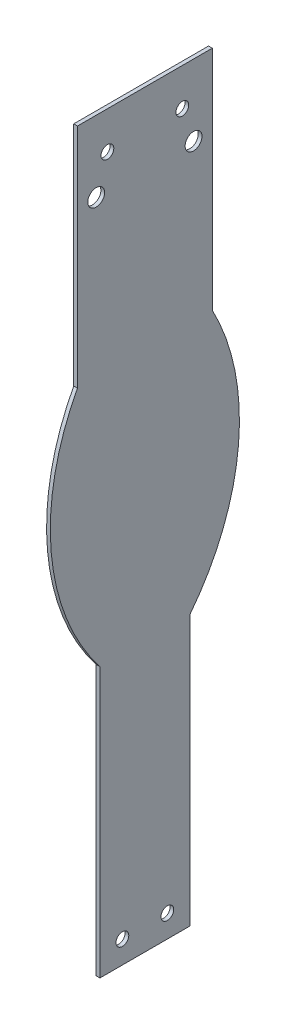
ISO-10303-21;
HEADER;
FILE_DESCRIPTION(('STEP AP214'),'2;1');
FILE_NAME('part.step','',(''),(''),'','','');
FILE_SCHEMA(('AUTOMOTIVE_DESIGN { 1 0 10303 214 1 1 1 1 }'));
ENDSEC;
DATA;
#1=APPLICATION_CONTEXT('core data for automotive mechanical design processes');
#2=APPLICATION_PROTOCOL_DEFINITION('international standard','automotive_design',2000,#1);
#3=PRODUCT_CONTEXT('',#1,'mechanical');
#4=PRODUCT('Part','Part','',(#3));
#5=PRODUCT_RELATED_PRODUCT_CATEGORY('part','',(#4));
#6=PRODUCT_DEFINITION_FORMATION('','',#4);
#7=PRODUCT_DEFINITION_CONTEXT('part definition',#1,'design');
#8=PRODUCT_DEFINITION('design','',#6,#7);
#9=PRODUCT_DEFINITION_SHAPE('','',#8);
#10=(LENGTH_UNIT() NAMED_UNIT(*) SI_UNIT(.MILLI.,.METRE.));
#11=(NAMED_UNIT(*) PLANE_ANGLE_UNIT() SI_UNIT($,.RADIAN.));
#12=(NAMED_UNIT(*) SI_UNIT($,.STERADIAN.) SOLID_ANGLE_UNIT());
#13=UNCERTAINTY_MEASURE_WITH_UNIT(LENGTH_MEASURE(1.E-05),#10,'distance_accuracy_value','');
#14=(GEOMETRIC_REPRESENTATION_CONTEXT(3) GLOBAL_UNCERTAINTY_ASSIGNED_CONTEXT((#13)) GLOBAL_UNIT_ASSIGNED_CONTEXT((#10,
#11,#12)) REPRESENTATION_CONTEXT('',''));
#15=CARTESIAN_POINT('',(0.,0.,0.));
#16=DIRECTION('',(0.,0.,1.));
#17=DIRECTION('',(1.,0.,0.));
#18=AXIS2_PLACEMENT_3D('',#15,#16,#17);
#19=CARTESIAN_POINT('',(1.,0.,18.));
#20=DIRECTION('',(0.,0.,-1.));
#21=DIRECTION('',(-1.,0.,0.));
#22=AXIS2_PLACEMENT_3D('',#19,#20,#21);
#23=PLANE('',#22);
#24=DIRECTION('',(0.,-1.,0.));
#25=VECTOR('',#24,1.);
#26=CARTESIAN_POINT('',(0.,0.,18.));
#27=LINE('',#26,#25);
#28=CARTESIAN_POINT('',(0.,0.,18.));
#29=VERTEX_POINT('',#28);
#30=CARTESIAN_POINT('',(0.,-60.6171169772277,18.));
#31=VERTEX_POINT('',#30);
#32=EDGE_CURVE('E132',#29,#31,#27,.T.);
#33=ORIENTED_EDGE('',*,*,#32,.T.);
#34=DIRECTION('',(-1.,0.,0.));
#35=VECTOR('',#34,1.);
#36=CARTESIAN_POINT('',(1.,-60.6171169772277,18.));
#37=LINE('',#36,#35);
#38=CARTESIAN_POINT('',(1.,-60.6171169772277,18.));
#39=VERTEX_POINT('',#38);
#40=EDGE_CURVE('E11',#39,#31,#37,.T.);
#41=ORIENTED_EDGE('',*,*,#40,.F.);
#42=DIRECTION('',(0.,-1.,0.));
#43=VECTOR('',#42,1.);
#44=CARTESIAN_POINT('',(1.,0.,18.));
#45=LINE('',#44,#43);
#46=CARTESIAN_POINT('',(1.,0.,18.));
#47=VERTEX_POINT('',#46);
#48=EDGE_CURVE('E153',#47,#39,#45,.T.);
#49=ORIENTED_EDGE('',*,*,#48,.F.);
#50=DIRECTION('',(-1.,0.,0.));
#51=VECTOR('',#50,1.);
#52=CARTESIAN_POINT('',(1.,0.,18.));
#53=LINE('',#52,#51);
#54=EDGE_CURVE('E51',#47,#29,#53,.T.);
#55=ORIENTED_EDGE('',*,*,#54,.T.);
#56=EDGE_LOOP('',(#33,#41,#49,#55));
#57=FACE_BOUND('',#56,.T.);
#58=ADVANCED_FACE('F35',(#57),#23,.F.);
#59=CARTESIAN_POINT('',(1.,-89.7000591872468,-36.7556615557578));
#60=DIRECTION('',(-1.,0.,0.));
#61=DIRECTION('',(0.,0.,1.));
#62=AXIS2_PLACEMENT_3D('',#59,#60,#61);
#63=CYLINDRICAL_SURFACE('',#62,62.);
#64=CARTESIAN_POINT('',(0.,-89.7000591872468,-36.7556615557578));
#65=DIRECTION('',(1.,0.,0.));
#66=DIRECTION('',(0.,0.,-1.));
#67=AXIS2_PLACEMENT_3D('',#64,#65,#66);
#68=CIRCLE('',#67,62.);
#69=CARTESIAN_POINT('',(0.,-128.,12.));
#70=VERTEX_POINT('',#69);
#71=EDGE_CURVE('E134',#31,#70,#68,.T.);
#72=ORIENTED_EDGE('',*,*,#71,.T.);
#73=DIRECTION('',(-1.,0.,0.));
#74=VECTOR('',#73,1.);
#75=CARTESIAN_POINT('',(1.,-128.,12.));
#76=LINE('',#75,#74);
#77=CARTESIAN_POINT('',(1.,-128.,12.));
#78=VERTEX_POINT('',#77);
#79=EDGE_CURVE('E43',#78,#70,#76,.T.);
#80=ORIENTED_EDGE('',*,*,#79,.F.);
#81=CARTESIAN_POINT('',(1.,-89.7000591872468,-36.7556615557578));
#82=DIRECTION('',(1.,0.,0.));
#83=DIRECTION('',(0.,0.,-1.));
#84=AXIS2_PLACEMENT_3D('',#81,#82,#83);
#85=CIRCLE('',#84,62.);
#86=EDGE_CURVE('E89',#39,#78,#85,.T.);
#87=ORIENTED_EDGE('',*,*,#86,.F.);
#88=ORIENTED_EDGE('',*,*,#40,.T.);
#89=EDGE_LOOP('',(#72,#80,#87,#88));
#90=FACE_BOUND('',#89,.T.);
#91=ADVANCED_FACE('F166',(#90),#63,.T.);
#92=CARTESIAN_POINT('',(1.,-200.,12.));
#93=DIRECTION('',(0.,0.,1.));
#94=DIRECTION('',(1.,0.,0.));
#95=AXIS2_PLACEMENT_3D('',#92,#93,#94);
#96=PLANE('',#95);
#97=DIRECTION('',(0.,1.,0.));
#98=VECTOR('',#97,1.);
#99=CARTESIAN_POINT('',(0.,-200.,12.));
#100=LINE('',#99,#98);
#101=CARTESIAN_POINT('',(0.,-200.,12.));
#102=VERTEX_POINT('',#101);
#103=EDGE_CURVE('E138',#102,#70,#100,.T.);
#104=ORIENTED_EDGE('',*,*,#103,.F.);
#105=DIRECTION('',(-1.,0.,0.));
#106=VECTOR('',#105,1.);
#107=CARTESIAN_POINT('',(1.,-200.,12.));
#108=LINE('',#107,#106);
#109=CARTESIAN_POINT('',(1.,-200.,12.));
#110=VERTEX_POINT('',#109);
#111=EDGE_CURVE('E159',#110,#102,#108,.T.);
#112=ORIENTED_EDGE('',*,*,#111,.F.);
#113=DIRECTION('',(0.,1.,0.));
#114=VECTOR('',#113,1.);
#115=CARTESIAN_POINT('',(1.,-200.,12.));
#116=LINE('',#115,#114);
#117=EDGE_CURVE('E165',#110,#78,#116,.T.);
#118=ORIENTED_EDGE('',*,*,#117,.T.);
#119=ORIENTED_EDGE('',*,*,#79,.T.);
#120=EDGE_LOOP('',(#104,#112,#118,#119));
#121=FACE_BOUND('',#120,.T.);
#122=ADVANCED_FACE('F163',(#121),#96,.T.);
#123=CARTESIAN_POINT('',(1.,-200.,-12.0000000000001));
#124=DIRECTION('',(0.,-1.,0.));
#125=DIRECTION('',(0.,0.,-1.));
#126=AXIS2_PLACEMENT_3D('',#123,#124,#125);
#127=PLANE('',#126);
#128=DIRECTION('',(0.,0.,1.));
#129=VECTOR('',#128,1.);
#130=CARTESIAN_POINT('',(0.,-200.,-12.0000000000001));
#131=LINE('',#130,#129);
#132=CARTESIAN_POINT('',(0.,-200.,-12.0000000000001));
#133=VERTEX_POINT('',#132);
#134=EDGE_CURVE('E141',#133,#102,#131,.T.);
#135=ORIENTED_EDGE('',*,*,#134,.F.);
#136=DIRECTION('',(-1.,0.,0.));
#137=VECTOR('',#136,1.);
#138=CARTESIAN_POINT('',(1.,-200.,-12.0000000000001));
#139=LINE('',#138,#137);
#140=CARTESIAN_POINT('',(1.,-200.,-12.0000000000001));
#141=VERTEX_POINT('',#140);
#142=EDGE_CURVE('E157',#141,#133,#139,.T.);
#143=ORIENTED_EDGE('',*,*,#142,.F.);
#144=DIRECTION('',(0.,0.,1.));
#145=VECTOR('',#144,1.);
#146=CARTESIAN_POINT('',(1.,-200.,-12.0000000000001));
#147=LINE('',#146,#145);
#148=EDGE_CURVE('E175',#141,#110,#147,.T.);
#149=ORIENTED_EDGE('',*,*,#148,.T.);
#150=ORIENTED_EDGE('',*,*,#111,.T.);
#151=EDGE_LOOP('',(#135,#143,#149,#150));
#152=FACE_BOUND('',#151,.T.);
#153=ADVANCED_FACE('F173',(#152),#127,.T.);
#154=CARTESIAN_POINT('',(1.,-200.,-12.0000000000001));
#155=DIRECTION('',(0.,0.,1.));
#156=DIRECTION('',(0.,-1.,0.));
#157=AXIS2_PLACEMENT_3D('',#154,#155,#156);
#158=PLANE('',#157);
#159=DIRECTION('',(0.,1.,0.));
#160=VECTOR('',#159,1.);
#161=CARTESIAN_POINT('',(0.,-200.,-12.0000000000001));
#162=LINE('',#161,#160);
#163=CARTESIAN_POINT('',(0.,-128.,-12.0000000000001));
#164=VERTEX_POINT('',#163);
#165=EDGE_CURVE('E144',#133,#164,#162,.T.);
#166=ORIENTED_EDGE('',*,*,#165,.T.);
#167=DIRECTION('',(-1.,0.,0.));
#168=VECTOR('',#167,1.);
#169=CARTESIAN_POINT('',(1.,-128.,-12.0000000000001));
#170=LINE('',#169,#168);
#171=CARTESIAN_POINT('',(1.,-128.,-12.0000000000001));
#172=VERTEX_POINT('',#171);
#173=EDGE_CURVE('E114',#172,#164,#170,.T.);
#174=ORIENTED_EDGE('',*,*,#173,.F.);
#175=DIRECTION('',(0.,1.,0.));
#176=VECTOR('',#175,1.);
#177=CARTESIAN_POINT('',(1.,-200.,-12.0000000000001));
#178=LINE('',#177,#176);
#179=EDGE_CURVE('E123',#141,#172,#178,.T.);
#180=ORIENTED_EDGE('',*,*,#179,.F.);
#181=ORIENTED_EDGE('',*,*,#142,.T.);
#182=EDGE_LOOP('',(#166,#174,#180,#181));
#183=FACE_BOUND('',#182,.T.);
#184=ADVANCED_FACE('F261',(#183),#158,.F.);
#185=CARTESIAN_POINT('',(1.,-89.7000591872468,36.7556615557577));
#186=DIRECTION('',(-1.,0.,0.));
#187=DIRECTION('',(0.,0.,1.));
#188=AXIS2_PLACEMENT_3D('',#185,#186,#187);
#189=CYLINDRICAL_SURFACE('',#188,62.);
#190=CARTESIAN_POINT('',(0.,-89.7000591872468,36.7556615557577));
#191=DIRECTION('',(-1.,0.,0.));
#192=DIRECTION('',(0.,0.,1.));
#193=AXIS2_PLACEMENT_3D('',#190,#191,#192);
#194=CIRCLE('',#193,62.);
#195=CARTESIAN_POINT('',(0.,-60.6171169772277,-18.));
#196=VERTEX_POINT('',#195);
#197=EDGE_CURVE('E110',#196,#164,#194,.T.);
#198=ORIENTED_EDGE('',*,*,#197,.F.);
#199=DIRECTION('',(-1.,0.,0.));
#200=VECTOR('',#199,1.);
#201=CARTESIAN_POINT('',(1.,-60.6171169772277,-18.));
#202=LINE('',#201,#200);
#203=CARTESIAN_POINT('',(1.,-60.6171169772277,-18.));
#204=VERTEX_POINT('',#203);
#205=EDGE_CURVE('E105',#204,#196,#202,.T.);
#206=ORIENTED_EDGE('',*,*,#205,.F.);
#207=CARTESIAN_POINT('',(1.,-89.7000591872468,36.7556615557577));
#208=DIRECTION('',(-1.,0.,0.));
#209=DIRECTION('',(0.,0.,1.));
#210=AXIS2_PLACEMENT_3D('',#207,#208,#209);
#211=CIRCLE('',#210,62.);
#212=EDGE_CURVE('E108',#204,#172,#211,.T.);
#213=ORIENTED_EDGE('',*,*,#212,.T.);
#214=ORIENTED_EDGE('',*,*,#173,.T.);
#215=EDGE_LOOP('',(#198,#206,#213,#214));
#216=FACE_BOUND('',#215,.T.);
#217=ADVANCED_FACE('F107',(#216),#189,.T.);
#218=CARTESIAN_POINT('',(1.,0.,-18.));
#219=DIRECTION('',(0.,0.,-1.));
#220=DIRECTION('',(0.,1.,0.));
#221=AXIS2_PLACEMENT_3D('',#218,#219,#220);
#222=PLANE('',#221);
#223=DIRECTION('',(0.,-1.,0.));
#224=VECTOR('',#223,1.);
#225=CARTESIAN_POINT('',(0.,0.,-18.));
#226=LINE('',#225,#224);
#227=CARTESIAN_POINT('',(0.,0.,-18.));
#228=VERTEX_POINT('',#227);
#229=EDGE_CURVE('E148',#228,#196,#226,.T.);
#230=ORIENTED_EDGE('',*,*,#229,.F.);
#231=DIRECTION('',(-1.,0.,0.));
#232=VECTOR('',#231,1.);
#233=CARTESIAN_POINT('',(1.,0.,-18.));
#234=LINE('',#233,#232);
#235=CARTESIAN_POINT('',(1.,0.,-18.));
#236=VERTEX_POINT('',#235);
#237=EDGE_CURVE('E77',#236,#228,#234,.T.);
#238=ORIENTED_EDGE('',*,*,#237,.F.);
#239=DIRECTION('',(0.,-1.,0.));
#240=VECTOR('',#239,1.);
#241=CARTESIAN_POINT('',(1.,0.,-18.));
#242=LINE('',#241,#240);
#243=EDGE_CURVE('E120',#236,#204,#242,.T.);
#244=ORIENTED_EDGE('',*,*,#243,.T.);
#245=ORIENTED_EDGE('',*,*,#205,.T.);
#246=EDGE_LOOP('',(#230,#238,#244,#245));
#247=FACE_BOUND('',#246,.T.);
#248=ADVANCED_FACE('F126',(#247),#222,.T.);
#249=CARTESIAN_POINT('',(1.,0.,18.));
#250=DIRECTION('',(0.,1.,0.));
#251=DIRECTION('',(0.,0.,1.));
#252=AXIS2_PLACEMENT_3D('',#249,#250,#251);
#253=PLANE('',#252);
#254=DIRECTION('',(0.,0.,-1.));
#255=VECTOR('',#254,1.);
#256=CARTESIAN_POINT('',(0.,0.,18.));
#257=LINE('',#256,#255);
#258=EDGE_CURVE('E150',#29,#228,#257,.T.);
#259=ORIENTED_EDGE('',*,*,#258,.F.);
#260=ORIENTED_EDGE('',*,*,#54,.F.);
#261=DIRECTION('',(0.,0.,-1.));
#262=VECTOR('',#261,1.);
#263=CARTESIAN_POINT('',(1.,0.,18.));
#264=LINE('',#263,#262);
#265=EDGE_CURVE('E127',#47,#236,#264,.T.);
#266=ORIENTED_EDGE('',*,*,#265,.T.);
#267=ORIENTED_EDGE('',*,*,#237,.T.);
#268=EDGE_LOOP('',(#259,#260,#266,#267));
#269=FACE_BOUND('',#268,.T.);
#270=ADVANCED_FACE('F249',(#269),#253,.T.);
#271=CARTESIAN_POINT('',(1.,-89.7000591872468,-36.7556615557578));
#272=DIRECTION('',(1.,0.,0.));
#273=DIRECTION('',(0.,0.,-1.));
#274=AXIS2_PLACEMENT_3D('',#271,#272,#273);
#275=PLANE('',#274);
#276=CARTESIAN_POINT('',(1.,-194.,6.));
#277=DIRECTION('',(-1.,0.,0.));
#278=DIRECTION('',(0.,0.,1.));
#279=AXIS2_PLACEMENT_3D('',#276,#277,#278);
#280=CIRCLE('',#279,1.70000000000001);
#281=CARTESIAN_POINT('',(1.,-194.,7.70000000000001));
#282=VERTEX_POINT('',#281);
#283=EDGE_CURVE('E210',#282,#282,#280,.T.);
#284=ORIENTED_EDGE('',*,*,#283,.T.);
#285=EDGE_LOOP('',(#284));
#286=FACE_BOUND('',#285,.T.);
#287=CARTESIAN_POINT('',(1.,-194.,-6.));
#288=DIRECTION('',(-1.,0.,0.));
#289=DIRECTION('',(0.,0.,1.));
#290=AXIS2_PLACEMENT_3D('',#287,#288,#289);
#291=CIRCLE('',#290,1.70000000000001);
#292=CARTESIAN_POINT('',(1.,-194.,-4.29999999999999));
#293=VERTEX_POINT('',#292);
#294=EDGE_CURVE('E204',#293,#293,#291,.T.);
#295=ORIENTED_EDGE('',*,*,#294,.T.);
#296=EDGE_LOOP('',(#295));
#297=FACE_BOUND('',#296,.T.);
#298=CARTESIAN_POINT('',(1.,-10.,-10.));
#299=DIRECTION('',(-1.,0.,0.));
#300=DIRECTION('',(0.,0.,1.));
#301=AXIS2_PLACEMENT_3D('',#298,#299,#300);
#302=CIRCLE('',#301,1.7);
#303=CARTESIAN_POINT('',(1.,-10.,-8.3));
#304=VERTEX_POINT('',#303);
#305=EDGE_CURVE('E198',#304,#304,#302,.T.);
#306=ORIENTED_EDGE('',*,*,#305,.T.);
#307=EDGE_LOOP('',(#306));
#308=FACE_BOUND('',#307,.T.);
#309=CARTESIAN_POINT('',(1.,-10.,10.));
#310=DIRECTION('',(-1.,0.,0.));
#311=DIRECTION('',(0.,0.,1.));
#312=AXIS2_PLACEMENT_3D('',#309,#310,#311);
#313=CIRCLE('',#312,1.7);
#314=CARTESIAN_POINT('',(1.,-10.,11.7));
#315=VERTEX_POINT('',#314);
#316=EDGE_CURVE('E192',#315,#315,#313,.T.);
#317=ORIENTED_EDGE('',*,*,#316,.T.);
#318=EDGE_LOOP('',(#317));
#319=FACE_BOUND('',#318,.T.);
#320=CARTESIAN_POINT('',(1.,-19.,13.));
#321=DIRECTION('',(-1.,0.,0.));
#322=DIRECTION('',(0.,0.,1.));
#323=AXIS2_PLACEMENT_3D('',#320,#321,#322);
#324=CIRCLE('',#323,2.25);
#325=CARTESIAN_POINT('',(1.,-19.,15.25));
#326=VERTEX_POINT('',#325);
#327=EDGE_CURVE('E186',#326,#326,#324,.T.);
#328=ORIENTED_EDGE('',*,*,#327,.T.);
#329=EDGE_LOOP('',(#328));
#330=FACE_BOUND('',#329,.T.);
#331=CARTESIAN_POINT('',(1.,-19.,-13.));
#332=DIRECTION('',(-1.,0.,0.));
#333=DIRECTION('',(0.,0.,1.));
#334=AXIS2_PLACEMENT_3D('',#331,#332,#333);
#335=CIRCLE('',#334,2.25);
#336=CARTESIAN_POINT('',(1.,-19.,-10.75));
#337=VERTEX_POINT('',#336);
#338=EDGE_CURVE('E135',#337,#337,#335,.T.);
#339=ORIENTED_EDGE('',*,*,#338,.T.);
#340=EDGE_LOOP('',(#339));
#341=FACE_BOUND('',#340,.T.);
#342=ORIENTED_EDGE('',*,*,#48,.T.);
#343=ORIENTED_EDGE('',*,*,#86,.T.);
#344=ORIENTED_EDGE('',*,*,#117,.F.);
#345=ORIENTED_EDGE('',*,*,#148,.F.);
#346=ORIENTED_EDGE('',*,*,#179,.T.);
#347=ORIENTED_EDGE('',*,*,#212,.F.);
#348=ORIENTED_EDGE('',*,*,#243,.F.);
#349=ORIENTED_EDGE('',*,*,#265,.F.);
#350=EDGE_LOOP('',(#342,#343,#344,#345,#346,#347,#348,#349));
#351=FACE_BOUND('',#350,.T.);
#352=ADVANCED_FACE('F118',(#286,#297,#308,#319,#330,#341,#351),#275,.T.);
#353=CARTESIAN_POINT('',(0.,-89.7000591872468,-36.7556615557578));
#354=DIRECTION('',(1.,0.,0.));
#355=DIRECTION('',(0.,0.,-1.));
#356=AXIS2_PLACEMENT_3D('',#353,#354,#355);
#357=PLANE('',#356);
#358=CARTESIAN_POINT('',(0.,-194.,6.));
#359=DIRECTION('',(-1.,0.,0.));
#360=DIRECTION('',(0.,0.,1.));
#361=AXIS2_PLACEMENT_3D('',#358,#359,#360);
#362=CIRCLE('',#361,1.69999999999998);
#363=CARTESIAN_POINT('',(0.,-194.,7.69999999999998));
#364=VERTEX_POINT('',#363);
#365=EDGE_CURVE('E213',#364,#364,#362,.T.);
#366=ORIENTED_EDGE('',*,*,#365,.F.);
#367=EDGE_LOOP('',(#366));
#368=FACE_BOUND('',#367,.T.);
#369=CARTESIAN_POINT('',(0.,-194.,-6.));
#370=DIRECTION('',(-1.,0.,0.));
#371=DIRECTION('',(0.,0.,1.));
#372=AXIS2_PLACEMENT_3D('',#369,#370,#371);
#373=CIRCLE('',#372,1.69999999999998);
#374=CARTESIAN_POINT('',(0.,-194.,-4.30000000000002));
#375=VERTEX_POINT('',#374);
#376=EDGE_CURVE('E207',#375,#375,#373,.T.);
#377=ORIENTED_EDGE('',*,*,#376,.F.);
#378=EDGE_LOOP('',(#377));
#379=FACE_BOUND('',#378,.T.);
#380=CARTESIAN_POINT('',(0.,-10.,-10.));
#381=DIRECTION('',(-1.,0.,0.));
#382=DIRECTION('',(0.,0.,1.));
#383=AXIS2_PLACEMENT_3D('',#380,#381,#382);
#384=CIRCLE('',#383,1.7);
#385=CARTESIAN_POINT('',(0.,-10.,-8.3));
#386=VERTEX_POINT('',#385);
#387=EDGE_CURVE('E201',#386,#386,#384,.T.);
#388=ORIENTED_EDGE('',*,*,#387,.F.);
#389=EDGE_LOOP('',(#388));
#390=FACE_BOUND('',#389,.T.);
#391=CARTESIAN_POINT('',(0.,-10.,10.));
#392=DIRECTION('',(-1.,0.,0.));
#393=DIRECTION('',(0.,0.,1.));
#394=AXIS2_PLACEMENT_3D('',#391,#392,#393);
#395=CIRCLE('',#394,1.7);
#396=CARTESIAN_POINT('',(0.,-10.,11.7));
#397=VERTEX_POINT('',#396);
#398=EDGE_CURVE('E195',#397,#397,#395,.T.);
#399=ORIENTED_EDGE('',*,*,#398,.F.);
#400=EDGE_LOOP('',(#399));
#401=FACE_BOUND('',#400,.T.);
#402=CARTESIAN_POINT('',(0.,-19.,13.));
#403=DIRECTION('',(-1.,0.,0.));
#404=DIRECTION('',(0.,0.,1.));
#405=AXIS2_PLACEMENT_3D('',#402,#403,#404);
#406=CIRCLE('',#405,2.24999999999999);
#407=CARTESIAN_POINT('',(0.,-19.,15.25));
#408=VERTEX_POINT('',#407);
#409=EDGE_CURVE('E189',#408,#408,#406,.T.);
#410=ORIENTED_EDGE('',*,*,#409,.F.);
#411=EDGE_LOOP('',(#410));
#412=FACE_BOUND('',#411,.T.);
#413=CARTESIAN_POINT('',(0.,-19.,-13.));
#414=DIRECTION('',(-1.,0.,0.));
#415=DIRECTION('',(0.,0.,1.));
#416=AXIS2_PLACEMENT_3D('',#413,#414,#415);
#417=CIRCLE('',#416,2.24999999999999);
#418=CARTESIAN_POINT('',(0.,-19.,-10.75));
#419=VERTEX_POINT('',#418);
#420=EDGE_CURVE('E183',#419,#419,#417,.T.);
#421=ORIENTED_EDGE('',*,*,#420,.F.);
#422=EDGE_LOOP('',(#421));
#423=FACE_BOUND('',#422,.T.);
#424=ORIENTED_EDGE('',*,*,#32,.F.);
#425=ORIENTED_EDGE('',*,*,#258,.T.);
#426=ORIENTED_EDGE('',*,*,#229,.T.);
#427=ORIENTED_EDGE('',*,*,#197,.T.);
#428=ORIENTED_EDGE('',*,*,#165,.F.);
#429=ORIENTED_EDGE('',*,*,#134,.T.);
#430=ORIENTED_EDGE('',*,*,#103,.T.);
#431=ORIENTED_EDGE('',*,*,#71,.F.);
#432=EDGE_LOOP('',(#424,#425,#426,#427,#428,#429,#430,#431));
#433=FACE_BOUND('',#432,.T.);
#434=ADVANCED_FACE('F169',(#368,#379,#390,#401,#412,#423,#433),#357,.F.);
#435=CARTESIAN_POINT('',(0.,-19.,-13.));
#436=DIRECTION('',(-1.,0.,0.));
#437=DIRECTION('',(0.,0.,1.));
#438=AXIS2_PLACEMENT_3D('',#435,#436,#437);
#439=CYLINDRICAL_SURFACE('',#438,2.24999999999999);
#440=ORIENTED_EDGE('',*,*,#338,.F.);
#441=EDGE_LOOP('',(#440));
#442=FACE_BOUND('',#441,.T.);
#443=ORIENTED_EDGE('',*,*,#420,.T.);
#444=EDGE_LOOP('',(#443));
#445=FACE_BOUND('',#444,.T.);
#446=ADVANCED_FACE('F221',(#442,#445),#439,.F.);
#447=CARTESIAN_POINT('',(0.,-19.,13.));
#448=DIRECTION('',(-1.,0.,0.));
#449=DIRECTION('',(0.,0.,1.));
#450=AXIS2_PLACEMENT_3D('',#447,#448,#449);
#451=CYLINDRICAL_SURFACE('',#450,2.24999999999999);
#452=ORIENTED_EDGE('',*,*,#327,.F.);
#453=EDGE_LOOP('',(#452));
#454=FACE_BOUND('',#453,.T.);
#455=ORIENTED_EDGE('',*,*,#409,.T.);
#456=EDGE_LOOP('',(#455));
#457=FACE_BOUND('',#456,.T.);
#458=ADVANCED_FACE('F234',(#454,#457),#451,.F.);
#459=CARTESIAN_POINT('',(0.,-10.,10.));
#460=DIRECTION('',(-1.,0.,0.));
#461=DIRECTION('',(0.,0.,1.));
#462=AXIS2_PLACEMENT_3D('',#459,#460,#461);
#463=CYLINDRICAL_SURFACE('',#462,1.7);
#464=ORIENTED_EDGE('',*,*,#316,.F.);
#465=EDGE_LOOP('',(#464));
#466=FACE_BOUND('',#465,.T.);
#467=ORIENTED_EDGE('',*,*,#398,.T.);
#468=EDGE_LOOP('',(#467));
#469=FACE_BOUND('',#468,.T.);
#470=ADVANCED_FACE('F240',(#466,#469),#463,.F.);
#471=CARTESIAN_POINT('',(0.,-10.,-10.));
#472=DIRECTION('',(-1.,0.,0.));
#473=DIRECTION('',(0.,0.,1.));
#474=AXIS2_PLACEMENT_3D('',#471,#472,#473);
#475=CYLINDRICAL_SURFACE('',#474,1.7);
#476=ORIENTED_EDGE('',*,*,#305,.F.);
#477=EDGE_LOOP('',(#476));
#478=FACE_BOUND('',#477,.T.);
#479=ORIENTED_EDGE('',*,*,#387,.T.);
#480=EDGE_LOOP('',(#479));
#481=FACE_BOUND('',#480,.T.);
#482=ADVANCED_FACE('F311',(#478,#481),#475,.F.);
#483=CARTESIAN_POINT('',(0.,-194.,-6.));
#484=DIRECTION('',(-1.,0.,0.));
#485=DIRECTION('',(0.,0.,1.));
#486=AXIS2_PLACEMENT_3D('',#483,#484,#485);
#487=CYLINDRICAL_SURFACE('',#486,1.69999999999999);
#488=ORIENTED_EDGE('',*,*,#294,.F.);
#489=EDGE_LOOP('',(#488));
#490=FACE_BOUND('',#489,.T.);
#491=ORIENTED_EDGE('',*,*,#376,.T.);
#492=EDGE_LOOP('',(#491));
#493=FACE_BOUND('',#492,.T.);
#494=ADVANCED_FACE('F319',(#490,#493),#487,.F.);
#495=CARTESIAN_POINT('',(0.,-194.,6.));
#496=DIRECTION('',(-1.,0.,0.));
#497=DIRECTION('',(0.,0.,1.));
#498=AXIS2_PLACEMENT_3D('',#495,#496,#497);
#499=CYLINDRICAL_SURFACE('',#498,1.69999999999999);
#500=ORIENTED_EDGE('',*,*,#283,.F.);
#501=EDGE_LOOP('',(#500));
#502=FACE_BOUND('',#501,.T.);
#503=ORIENTED_EDGE('',*,*,#365,.T.);
#504=EDGE_LOOP('',(#503));
#505=FACE_BOUND('',#504,.T.);
#506=ADVANCED_FACE('F217',(#502,#505),#499,.F.);
#507=CLOSED_SHELL('',(#58,#91,#122,#153,#184,#217,#248,#270,#352,#434,#446,#458,#470,#482,#494,#506));
#508=MANIFOLD_SOLID_BREP('B2',#507);
#509=ADVANCED_BREP_SHAPE_REPRESENTATION('',(#18,#508),#14);
#510=SHAPE_DEFINITION_REPRESENTATION(#9,#509);
ENDSEC;
END-ISO-10303-21;
